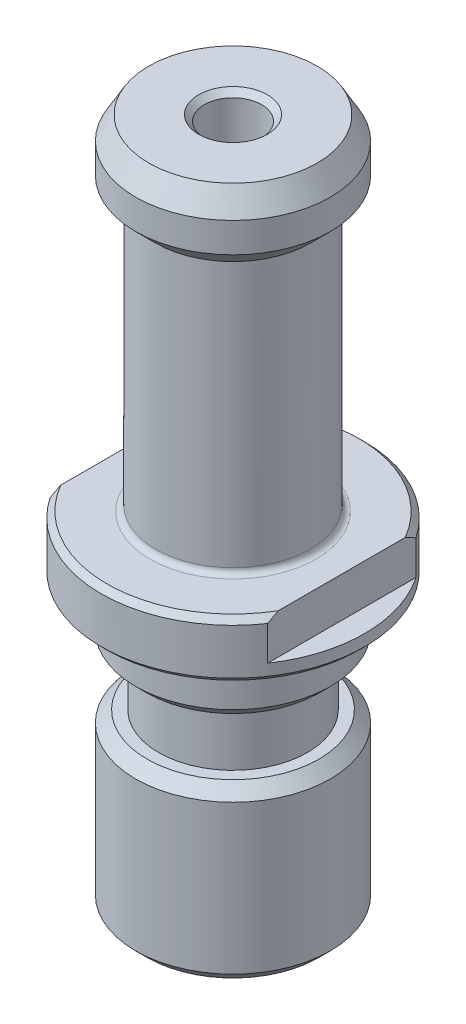
ISO-10303-21;
HEADER;
FILE_DESCRIPTION(('STEP AP214'),'2;1');
FILE_NAME('part.step','',(''),(''),'','','');
FILE_SCHEMA(('AUTOMOTIVE_DESIGN { 1 0 10303 214 1 1 1 1 }'));
ENDSEC;
DATA;
#1=APPLICATION_CONTEXT('core data for automotive mechanical design processes');
#2=APPLICATION_PROTOCOL_DEFINITION('international standard','automotive_design',2000,#1);
#3=PRODUCT_CONTEXT('',#1,'mechanical');
#4=PRODUCT('Part','Part','',(#3));
#5=PRODUCT_RELATED_PRODUCT_CATEGORY('part','',(#4));
#6=PRODUCT_DEFINITION_FORMATION('','',#4);
#7=PRODUCT_DEFINITION_CONTEXT('part definition',#1,'design');
#8=PRODUCT_DEFINITION('design','',#6,#7);
#9=PRODUCT_DEFINITION_SHAPE('','',#8);
#10=(LENGTH_UNIT() NAMED_UNIT(*) SI_UNIT(.MILLI.,.METRE.));
#11=(NAMED_UNIT(*) PLANE_ANGLE_UNIT() SI_UNIT($,.RADIAN.));
#12=(NAMED_UNIT(*) SI_UNIT($,.STERADIAN.) SOLID_ANGLE_UNIT());
#13=UNCERTAINTY_MEASURE_WITH_UNIT(LENGTH_MEASURE(1.E-05),#10,'distance_accuracy_value','');
#14=(GEOMETRIC_REPRESENTATION_CONTEXT(3) GLOBAL_UNCERTAINTY_ASSIGNED_CONTEXT((#13)) GLOBAL_UNIT_ASSIGNED_CONTEXT((#10,
#11,#12)) REPRESENTATION_CONTEXT('',''));
#15=CARTESIAN_POINT('',(0.,0.,0.));
#16=DIRECTION('',(0.,0.,1.));
#17=DIRECTION('',(1.,0.,0.));
#18=AXIS2_PLACEMENT_3D('',#15,#16,#17);
#19=CARTESIAN_POINT('',(0.,14.,0.));
#20=DIRECTION('',(0.,-1.,0.));
#21=DIRECTION('',(1.,0.,0.));
#22=AXIS2_PLACEMENT_3D('',#19,#20,#21);
#23=CONICAL_SURFACE('',#22,8.5,0.785398163397444);
#24=CARTESIAN_POINT('',(0.,15.,0.));
#25=DIRECTION('',(0.,-1.,0.));
#26=DIRECTION('',(1.,0.,0.));
#27=AXIS2_PLACEMENT_3D('',#24,#25,#26);
#28=CIRCLE('',#27,7.5);
#29=CARTESIAN_POINT('',(7.5,15.,0.));
#30=VERTEX_POINT('',#29);
#31=EDGE_CURVE('E139',#30,#30,#28,.T.);
#32=ORIENTED_EDGE('',*,*,#31,.T.);
#33=EDGE_LOOP('',(#32));
#34=FACE_BOUND('',#33,.T.);
#35=CARTESIAN_POINT('',(0.,14.,0.));
#36=DIRECTION('',(0.,-1.,0.));
#37=DIRECTION('',(0.,0.,-1.));
#38=AXIS2_PLACEMENT_3D('',#35,#36,#37);
#39=CIRCLE('',#38,8.5);
#40=CARTESIAN_POINT('',(0.,14.,-8.5));
#41=VERTEX_POINT('',#40);
#42=EDGE_CURVE('E136',#41,#41,#39,.T.);
#43=ORIENTED_EDGE('',*,*,#42,.F.);
#44=EDGE_LOOP('',(#43));
#45=FACE_BOUND('',#44,.T.);
#46=ADVANCED_FACE('F16',(#34,#45),#23,.T.);
#47=CARTESIAN_POINT('',(0.,15.,0.));
#48=DIRECTION('',(0.,-1.,0.));
#49=DIRECTION('',(0.,0.,-1.));
#50=AXIS2_PLACEMENT_3D('',#47,#48,#49);
#51=PLANE('',#50);
#52=CARTESIAN_POINT('',(0.,15.,0.));
#53=DIRECTION('',(0.,1.,0.));
#54=DIRECTION('',(0.,0.,1.));
#55=AXIS2_PLACEMENT_3D('',#52,#53,#54);
#56=CIRCLE('',#55,6.5);
#57=CARTESIAN_POINT('',(0.,15.,6.5));
#58=VERTEX_POINT('',#57);
#59=EDGE_CURVE('E135',#58,#58,#56,.T.);
#60=ORIENTED_EDGE('',*,*,#59,.F.);
#61=EDGE_LOOP('',(#60));
#62=FACE_BOUND('',#61,.T.);
#63=ORIENTED_EDGE('',*,*,#31,.F.);
#64=EDGE_LOOP('',(#63));
#65=FACE_BOUND('',#64,.T.);
#66=ADVANCED_FACE('F255',(#62,#65),#51,.F.);
#67=CARTESIAN_POINT('',(0.,25.,0.));
#68=DIRECTION('',(0.,-1.,0.));
#69=DIRECTION('',(0.,0.,-1.));
#70=AXIS2_PLACEMENT_3D('',#67,#68,#69);
#71=CYLINDRICAL_SURFACE('',#70,8.5);
#72=ORIENTED_EDGE('',*,*,#42,.T.);
#73=EDGE_LOOP('',(#72));
#74=FACE_BOUND('',#73,.T.);
#75=CARTESIAN_POINT('',(0.,1.,0.));
#76=DIRECTION('',(0.,1.,0.));
#77=DIRECTION('',(0.,0.,1.));
#78=AXIS2_PLACEMENT_3D('',#75,#76,#77);
#79=CIRCLE('',#78,8.5);
#80=CARTESIAN_POINT('',(0.,1.,8.5));
#81=VERTEX_POINT('',#80);
#82=EDGE_CURVE('E131',#81,#81,#79,.F.);
#83=ORIENTED_EDGE('',*,*,#82,.F.);
#84=EDGE_LOOP('',(#83));
#85=FACE_BOUND('',#84,.T.);
#86=ADVANCED_FACE('F252',(#74,#85),#71,.T.);
#87=CARTESIAN_POINT('',(0.,15.,0.));
#88=DIRECTION('',(0.,1.,0.));
#89=DIRECTION('',(0.,0.,1.));
#90=AXIS2_PLACEMENT_3D('',#87,#88,#89);
#91=CYLINDRICAL_SURFACE('',#90,6.5);
#92=CARTESIAN_POINT('',(0.,20.,0.));
#93=DIRECTION('',(0.,1.,0.));
#94=DIRECTION('',(0.,0.,1.));
#95=AXIS2_PLACEMENT_3D('',#92,#93,#94);
#96=CIRCLE('',#95,6.5);
#97=CARTESIAN_POINT('',(0.,20.,6.5));
#98=VERTEX_POINT('',#97);
#99=EDGE_CURVE('E134',#98,#98,#96,.T.);
#100=ORIENTED_EDGE('',*,*,#99,.F.);
#101=EDGE_LOOP('',(#100));
#102=FACE_BOUND('',#101,.T.);
#103=ORIENTED_EDGE('',*,*,#59,.T.);
#104=EDGE_LOOP('',(#103));
#105=FACE_BOUND('',#104,.T.);
#106=ADVANCED_FACE('F248',(#102,#105),#91,.T.);
#107=CARTESIAN_POINT('',(0.,1.,0.));
#108=DIRECTION('',(0.,1.,0.));
#109=DIRECTION('',(0.,0.,1.));
#110=AXIS2_PLACEMENT_3D('',#107,#108,#109);
#111=CONICAL_SURFACE('',#110,8.5,0.785398163397445);
#112=CARTESIAN_POINT('',(0.,0.,0.));
#113=DIRECTION('',(0.,1.,0.));
#114=DIRECTION('',(0.,0.,1.));
#115=AXIS2_PLACEMENT_3D('',#112,#113,#114);
#116=CIRCLE('',#115,7.5);
#117=CARTESIAN_POINT('',(0.,0.,7.5));
#118=VERTEX_POINT('',#117);
#119=EDGE_CURVE('E351',#118,#118,#116,.T.);
#120=ORIENTED_EDGE('',*,*,#119,.T.);
#121=EDGE_LOOP('',(#120));
#122=FACE_BOUND('',#121,.T.);
#123=ORIENTED_EDGE('',*,*,#82,.T.);
#124=EDGE_LOOP('',(#123));
#125=FACE_BOUND('',#124,.T.);
#126=ADVANCED_FACE('F244',(#122,#125),#111,.T.);
#127=CARTESIAN_POINT('',(0.,20.,0.));
#128=DIRECTION('',(0.,-1.,0.));
#129=DIRECTION('',(0.,0.,-1.));
#130=AXIS2_PLACEMENT_3D('',#127,#128,#129);
#131=PLANE('',#130);
#132=ORIENTED_EDGE('',*,*,#99,.T.);
#133=EDGE_LOOP('',(#132));
#134=FACE_BOUND('',#133,.T.);
#135=CARTESIAN_POINT('',(0.,20.,0.));
#136=DIRECTION('',(0.,1.,0.));
#137=DIRECTION('',(0.,0.,1.));
#138=AXIS2_PLACEMENT_3D('',#135,#136,#137);
#139=CIRCLE('',#138,7.5);
#140=CARTESIAN_POINT('',(0.,20.,7.5));
#141=VERTEX_POINT('',#140);
#142=EDGE_CURVE('E348',#141,#141,#139,.T.);
#143=ORIENTED_EDGE('',*,*,#142,.F.);
#144=EDGE_LOOP('',(#143));
#145=FACE_BOUND('',#144,.T.);
#146=ADVANCED_FACE('F240',(#134,#145),#131,.T.);
#147=CARTESIAN_POINT('',(0.,0.,0.));
#148=DIRECTION('',(0.,1.,0.));
#149=DIRECTION('',(0.,0.,1.));
#150=AXIS2_PLACEMENT_3D('',#147,#148,#149);
#151=PLANE('',#150);
#152=ORIENTED_EDGE('',*,*,#119,.F.);
#153=EDGE_LOOP('',(#152));
#154=FACE_BOUND('',#153,.T.);
#155=CARTESIAN_POINT('',(0.,0.,0.));
#156=DIRECTION('',(0.,-1.,0.));
#157=DIRECTION('',(0.,0.,-1.));
#158=AXIS2_PLACEMENT_3D('',#155,#156,#157);
#159=CIRCLE('',#158,3.00000000004274);
#160=CARTESIAN_POINT('',(0.,0.,-3.00000000004274));
#161=VERTEX_POINT('',#160);
#162=EDGE_CURVE('E130',#161,#161,#159,.F.);
#163=ORIENTED_EDGE('',*,*,#162,.T.);
#164=EDGE_LOOP('',(#163));
#165=FACE_BOUND('',#164,.T.);
#166=ADVANCED_FACE('F236',(#154,#165),#151,.F.);
#167=CARTESIAN_POINT('',(0.,21.,0.));
#168=DIRECTION('',(0.,1.,0.));
#169=DIRECTION('',(0.,0.,1.));
#170=AXIS2_PLACEMENT_3D('',#167,#168,#169);
#171=CONICAL_SURFACE('',#170,8.5,0.785398163397452);
#172=ORIENTED_EDGE('',*,*,#142,.T.);
#173=EDGE_LOOP('',(#172));
#174=FACE_BOUND('',#173,.T.);
#175=CARTESIAN_POINT('',(0.,21.,0.));
#176=DIRECTION('',(0.,-1.,0.));
#177=DIRECTION('',(0.,0.,-1.));
#178=AXIS2_PLACEMENT_3D('',#175,#176,#177);
#179=CIRCLE('',#178,8.5);
#180=CARTESIAN_POINT('',(0.,21.,-8.5));
#181=VERTEX_POINT('',#180);
#182=EDGE_CURVE('E127',#181,#181,#179,.F.);
#183=ORIENTED_EDGE('',*,*,#182,.F.);
#184=EDGE_LOOP('',(#183));
#185=FACE_BOUND('',#184,.T.);
#186=ADVANCED_FACE('F232',(#174,#185),#171,.T.);
#187=CARTESIAN_POINT('',(0.,0.,0.));
#188=DIRECTION('',(0.,-1.,0.));
#189=DIRECTION('',(0.,0.,-1.));
#190=AXIS2_PLACEMENT_3D('',#187,#188,#189);
#191=CONICAL_SURFACE('',#190,3.00000000004274,0.785398163397448);
#192=CARTESIAN_POINT('',(0.,0.5,0.));
#193=DIRECTION('',(0.,-1.,0.));
#194=DIRECTION('',(0.,0.,-1.));
#195=AXIS2_PLACEMENT_3D('',#192,#193,#194);
#196=CIRCLE('',#195,2.5);
#197=CARTESIAN_POINT('',(0.,0.5,-2.5));
#198=VERTEX_POINT('',#197);
#199=EDGE_CURVE('E124',#198,#198,#196,.F.);
#200=ORIENTED_EDGE('',*,*,#199,.T.);
#201=EDGE_LOOP('',(#200));
#202=FACE_BOUND('',#201,.T.);
#203=ORIENTED_EDGE('',*,*,#162,.F.);
#204=EDGE_LOOP('',(#203));
#205=FACE_BOUND('',#204,.T.);
#206=ADVANCED_FACE('F228',(#202,#205),#191,.F.);
#207=CARTESIAN_POINT('',(0.,25.,0.));
#208=DIRECTION('',(0.,-1.,0.));
#209=DIRECTION('',(0.,0.,-1.));
#210=AXIS2_PLACEMENT_3D('',#207,#208,#209);
#211=CYLINDRICAL_SURFACE('',#210,8.5);
#212=CARTESIAN_POINT('',(0.,25.,0.));
#213=DIRECTION('',(0.,-1.,0.));
#214=DIRECTION('',(0.,0.,-1.));
#215=AXIS2_PLACEMENT_3D('',#212,#213,#214);
#216=CIRCLE('',#215,8.5);
#217=CARTESIAN_POINT('',(0.,25.,-8.5));
#218=VERTEX_POINT('',#217);
#219=EDGE_CURVE('E123',#218,#218,#216,.F.);
#220=ORIENTED_EDGE('',*,*,#219,.F.);
#221=EDGE_LOOP('',(#220));
#222=FACE_BOUND('',#221,.T.);
#223=ORIENTED_EDGE('',*,*,#182,.T.);
#224=EDGE_LOOP('',(#223));
#225=FACE_BOUND('',#224,.T.);
#226=ADVANCED_FACE('F224',(#222,#225),#211,.T.);
#227=CARTESIAN_POINT('',(0.,0.,0.));
#228=DIRECTION('',(0.,-1.,0.));
#229=DIRECTION('',(0.,0.,-1.));
#230=AXIS2_PLACEMENT_3D('',#227,#228,#229);
#231=CYLINDRICAL_SURFACE('',#230,2.5);
#232=CARTESIAN_POINT('',(0.,59.5000000000709,0.));
#233=DIRECTION('',(0.,1.,0.));
#234=DIRECTION('',(0.,0.,1.));
#235=AXIS2_PLACEMENT_3D('',#232,#233,#234);
#236=CIRCLE('',#235,2.49999999999772);
#237=CARTESIAN_POINT('',(0.,59.5000000000709,2.49999999999772));
#238=VERTEX_POINT('',#237);
#239=EDGE_CURVE('E119',#238,#238,#236,.T.);
#240=ORIENTED_EDGE('',*,*,#239,.T.);
#241=EDGE_LOOP('',(#240));
#242=FACE_BOUND('',#241,.T.);
#243=ORIENTED_EDGE('',*,*,#199,.F.);
#244=EDGE_LOOP('',(#243));
#245=FACE_BOUND('',#244,.T.);
#246=ADVANCED_FACE('F220',(#242,#245),#231,.F.);
#247=CARTESIAN_POINT('',(0.,25.,0.));
#248=DIRECTION('',(0.,-1.,0.));
#249=DIRECTION('',(0.,0.,-1.));
#250=AXIS2_PLACEMENT_3D('',#247,#248,#249);
#251=PLANE('',#250);
#252=ORIENTED_EDGE('',*,*,#219,.T.);
#253=EDGE_LOOP('',(#252));
#254=FACE_BOUND('',#253,.T.);
#255=CARTESIAN_POINT('',(0.,25.,0.));
#256=DIRECTION('',(0.,1.,0.));
#257=DIRECTION('',(-1.,0.,0.));
#258=AXIS2_PLACEMENT_3D('',#255,#256,#257);
#259=CIRCLE('',#258,11.);
#260=CARTESIAN_POINT('',(-11.,25.,0.));
#261=VERTEX_POINT('',#260);
#262=EDGE_CURVE('E122',#261,#261,#259,.T.);
#263=ORIENTED_EDGE('',*,*,#262,.F.);
#264=EDGE_LOOP('',(#263));
#265=FACE_BOUND('',#264,.T.);
#266=ADVANCED_FACE('F216',(#254,#265),#251,.T.);
#267=CARTESIAN_POINT('',(0.,60.0000000000023,0.));
#268=DIRECTION('',(0.,1.,0.));
#269=DIRECTION('',(0.,0.,1.));
#270=AXIS2_PLACEMENT_3D('',#267,#268,#269);
#271=CONICAL_SURFACE('',#270,2.99999999992906,0.785398163397448);
#272=ORIENTED_EDGE('',*,*,#239,.F.);
#273=EDGE_LOOP('',(#272));
#274=FACE_BOUND('',#273,.T.);
#275=CARTESIAN_POINT('',(0.,60.0000000000023,0.));
#276=DIRECTION('',(0.,1.,0.));
#277=DIRECTION('',(0.,0.,1.));
#278=AXIS2_PLACEMENT_3D('',#275,#276,#277);
#279=CIRCLE('',#278,2.99999999992906);
#280=CARTESIAN_POINT('',(0.,60.0000000000023,2.99999999992906));
#281=VERTEX_POINT('',#280);
#282=EDGE_CURVE('E87',#281,#281,#279,.F.);
#283=ORIENTED_EDGE('',*,*,#282,.F.);
#284=EDGE_LOOP('',(#283));
#285=FACE_BOUND('',#284,.T.);
#286=ADVANCED_FACE('F212',(#274,#285),#271,.F.);
#287=CARTESIAN_POINT('',(0.,25.5,0.));
#288=DIRECTION('',(0.,1.,0.));
#289=DIRECTION('',(-1.,0.,0.));
#290=AXIS2_PLACEMENT_3D('',#287,#288,#289);
#291=CONICAL_SURFACE('',#290,11.5,0.785398163397452);
#292=ORIENTED_EDGE('',*,*,#262,.T.);
#293=EDGE_LOOP('',(#292));
#294=FACE_BOUND('',#293,.T.);
#295=CARTESIAN_POINT('',(0.,25.5,0.));
#296=DIRECTION('',(0.,-1.,0.));
#297=DIRECTION('',(0.,0.,-1.));
#298=AXIS2_PLACEMENT_3D('',#295,#296,#297);
#299=CIRCLE('',#298,11.5);
#300=CARTESIAN_POINT('',(0.,25.5,-11.5));
#301=VERTEX_POINT('',#300);
#302=EDGE_CURVE('E116',#301,#301,#299,.F.);
#303=ORIENTED_EDGE('',*,*,#302,.F.);
#304=EDGE_LOOP('',(#303));
#305=FACE_BOUND('',#304,.T.);
#306=ADVANCED_FACE('F208',(#294,#305),#291,.T.);
#307=CARTESIAN_POINT('',(0.,60.,0.));
#308=DIRECTION('',(0.,1.,0.));
#309=DIRECTION('',(0.,0.,1.));
#310=AXIS2_PLACEMENT_3D('',#307,#308,#309);
#311=PLANE('',#310);
#312=CARTESIAN_POINT('',(0.,60.,0.));
#313=DIRECTION('',(0.,-1.,0.));
#314=DIRECTION('',(0.,0.,-1.));
#315=AXIS2_PLACEMENT_3D('',#312,#313,#314);
#316=CIRCLE('',#315,7.34529946162073);
#317=CARTESIAN_POINT('',(0.,60.,-7.34529946162073));
#318=VERTEX_POINT('',#317);
#319=EDGE_CURVE('E98',#318,#318,#316,.T.);
#320=ORIENTED_EDGE('',*,*,#319,.F.);
#321=EDGE_LOOP('',(#320));
#322=FACE_BOUND('',#321,.T.);
#323=ORIENTED_EDGE('',*,*,#282,.T.);
#324=EDGE_LOOP('',(#323));
#325=FACE_BOUND('',#324,.T.);
#326=ADVANCED_FACE('F205',(#322,#325),#311,.T.);
#327=CARTESIAN_POINT('',(0.,26.5,0.));
#328=DIRECTION('',(0.,1.,0.));
#329=DIRECTION('',(0.,0.,1.));
#330=AXIS2_PLACEMENT_3D('',#327,#328,#329);
#331=PLANE('',#330);
#332=CARTESIAN_POINT('',(0.,26.5,0.));
#333=DIRECTION('',(0.,-1.,0.));
#334=DIRECTION('',(0.,0.,-1.));
#335=AXIS2_PLACEMENT_3D('',#332,#333,#334);
#336=CIRCLE('',#335,11.5);
#337=CARTESIAN_POINT('',(9.5,26.5,-6.48074069840785));
#338=VERTEX_POINT('',#337);
#339=CARTESIAN_POINT('',(9.5,26.5,6.48074069840786));
#340=VERTEX_POINT('',#339);
#341=EDGE_CURVE('E74',#338,#340,#336,.T.);
#342=ORIENTED_EDGE('',*,*,#341,.F.);
#343=DIRECTION('',(0.,0.,-1.));
#344=VECTOR('',#343,1.);
#345=CARTESIAN_POINT('',(9.5,26.5,25.));
#346=LINE('',#345,#344);
#347=EDGE_CURVE('E89',#340,#338,#346,.T.);
#348=ORIENTED_EDGE('',*,*,#347,.F.);
#349=EDGE_LOOP('',(#342,#348));
#350=FACE_BOUND('',#349,.T.);
#351=ADVANCED_FACE('F90',(#350),#331,.T.);
#352=CARTESIAN_POINT('',(0.,26.5,0.));
#353=DIRECTION('',(0.,1.,0.));
#354=DIRECTION('',(0.,0.,1.));
#355=AXIS2_PLACEMENT_3D('',#352,#353,#354);
#356=PLANE('',#355);
#357=CARTESIAN_POINT('',(0.,26.5,0.));
#358=DIRECTION('',(0.,-1.,0.));
#359=DIRECTION('',(0.,0.,-1.));
#360=AXIS2_PLACEMENT_3D('',#357,#358,#359);
#361=CIRCLE('',#360,11.5);
#362=CARTESIAN_POINT('',(-9.5,26.5,6.48074069840787));
#363=VERTEX_POINT('',#362);
#364=CARTESIAN_POINT('',(-9.5,26.5,-6.48074069840787));
#365=VERTEX_POINT('',#364);
#366=EDGE_CURVE('E86',#363,#365,#361,.T.);
#367=ORIENTED_EDGE('',*,*,#366,.F.);
#368=DIRECTION('',(0.,0.,1.));
#369=VECTOR('',#368,1.);
#370=CARTESIAN_POINT('',(-9.5,26.5,25.));
#371=LINE('',#370,#369);
#372=EDGE_CURVE('E112',#365,#363,#371,.T.);
#373=ORIENTED_EDGE('',*,*,#372,.F.);
#374=EDGE_LOOP('',(#367,#373));
#375=FACE_BOUND('',#374,.T.);
#376=ADVANCED_FACE('F199',(#375),#356,.T.);
#377=CARTESIAN_POINT('',(0.,60.,0.));
#378=DIRECTION('',(0.,-1.,0.));
#379=DIRECTION('',(0.,0.,-1.));
#380=AXIS2_PLACEMENT_3D('',#377,#378,#379);
#381=CYLINDRICAL_SURFACE('',#380,11.5);
#382=DIRECTION('',(0.,1.,0.));
#383=VECTOR('',#382,1.);
#384=CARTESIAN_POINT('',(9.5,26.5,6.48074069840786));
#385=LINE('',#384,#383);
#386=CARTESIAN_POINT('',(9.5,29.5,6.48074069840785));
#387=VERTEX_POINT('',#386);
#388=EDGE_CURVE('E81',#387,#340,#385,.F.);
#389=ORIENTED_EDGE('',*,*,#388,.F.);
#390=CARTESIAN_POINT('',(0.,29.5,0.));
#391=DIRECTION('',(0.,-1.,0.));
#392=DIRECTION('',(0.,0.,-1.));
#393=AXIS2_PLACEMENT_3D('',#390,#391,#392);
#394=CIRCLE('',#393,11.5);
#395=CARTESIAN_POINT('',(-9.5,29.5,6.48074069840786));
#396=VERTEX_POINT('',#395);
#397=EDGE_CURVE('E96',#396,#387,#394,.F.);
#398=ORIENTED_EDGE('',*,*,#397,.F.);
#399=DIRECTION('',(0.,1.,0.));
#400=VECTOR('',#399,1.);
#401=CARTESIAN_POINT('',(-9.5,26.5,6.48074069840787));
#402=LINE('',#401,#400);
#403=EDGE_CURVE('E114',#363,#396,#402,.T.);
#404=ORIENTED_EDGE('',*,*,#403,.F.);
#405=ORIENTED_EDGE('',*,*,#366,.T.);
#406=DIRECTION('',(0.,1.,0.));
#407=VECTOR('',#406,1.);
#408=CARTESIAN_POINT('',(-9.5,26.5,-6.48074069840787));
#409=LINE('',#408,#407);
#410=CARTESIAN_POINT('',(-9.5,29.5,-6.48074069840786));
#411=VERTEX_POINT('',#410);
#412=EDGE_CURVE('E106',#411,#365,#409,.F.);
#413=ORIENTED_EDGE('',*,*,#412,.F.);
#414=CARTESIAN_POINT('',(0.,29.5,0.));
#415=DIRECTION('',(0.,-1.,0.));
#416=DIRECTION('',(0.,0.,-1.));
#417=AXIS2_PLACEMENT_3D('',#414,#415,#416);
#418=CIRCLE('',#417,11.5);
#419=CARTESIAN_POINT('',(9.5,29.5,-6.48074069840785));
#420=VERTEX_POINT('',#419);
#421=EDGE_CURVE('E103',#420,#411,#418,.F.);
#422=ORIENTED_EDGE('',*,*,#421,.F.);
#423=DIRECTION('',(0.,1.,0.));
#424=VECTOR('',#423,1.);
#425=CARTESIAN_POINT('',(9.5,26.5,-6.48074069840785));
#426=LINE('',#425,#424);
#427=EDGE_CURVE('E84',#338,#420,#426,.T.);
#428=ORIENTED_EDGE('',*,*,#427,.F.);
#429=ORIENTED_EDGE('',*,*,#341,.T.);
#430=EDGE_LOOP('',(#389,#398,#404,#405,#413,#422,#428,#429));
#431=FACE_BOUND('',#430,.T.);
#432=ORIENTED_EDGE('',*,*,#302,.T.);
#433=EDGE_LOOP('',(#432));
#434=FACE_BOUND('',#433,.T.);
#435=ADVANCED_FACE('F78',(#431,#434),#381,.T.);
#436=CARTESIAN_POINT('',(0.,58.,0.));
#437=DIRECTION('',(0.,-1.,0.));
#438=DIRECTION('',(0.,0.,-1.));
#439=AXIS2_PLACEMENT_3D('',#436,#437,#438);
#440=CONICAL_SURFACE('',#439,8.5,0.523598775598299);
#441=CARTESIAN_POINT('',(0.,58.,0.));
#442=DIRECTION('',(0.,1.,0.));
#443=DIRECTION('',(0.,0.,1.));
#444=AXIS2_PLACEMENT_3D('',#441,#442,#443);
#445=CIRCLE('',#444,8.5);
#446=CARTESIAN_POINT('',(0.,58.,8.5));
#447=VERTEX_POINT('',#446);
#448=EDGE_CURVE('E148',#447,#447,#445,.F.);
#449=ORIENTED_EDGE('',*,*,#448,.F.);
#450=EDGE_LOOP('',(#449));
#451=FACE_BOUND('',#450,.T.);
#452=ORIENTED_EDGE('',*,*,#319,.T.);
#453=EDGE_LOOP('',(#452));
#454=FACE_BOUND('',#453,.T.);
#455=ADVANCED_FACE('F191',(#451,#454),#440,.T.);
#456=CARTESIAN_POINT('',(0.,29.5,0.));
#457=DIRECTION('',(0.,-1.,0.));
#458=DIRECTION('',(1.,0.,0.));
#459=AXIS2_PLACEMENT_3D('',#456,#457,#458);
#460=CONICAL_SURFACE('',#459,11.5,0.785398163397445);
#461=CARTESIAN_POINT('',(-9.5,29.5,6.48074069840786));
#462=CARTESIAN_POINT('',(-9.5,29.5434024502784,6.40372265845442));
#463=CARTESIAN_POINT('',(-9.5,29.5864052052821,6.32647872857657));
#464=CARTESIAN_POINT('',(-9.5,29.671555802403,6.17153461480119));
#465=CARTESIAN_POINT('',(-9.5,29.7137037578524,6.09383449317204));
#466=CARTESIAN_POINT('',(-9.5,29.7971012369425,5.93795223956829));
#467=CARTESIAN_POINT('',(-9.5,29.8383507521402,5.85977010307291));
#468=CARTESIAN_POINT('',(-9.5,29.9199016831173,5.70289977620134));
#469=CARTESIAN_POINT('',(-9.5,29.9602029716032,5.62421151966688));
#470=CARTESIAN_POINT('',(-9.5,30.,5.54526825320477));
#471=B_SPLINE_CURVE_WITH_KNOTS('',3,(#461,#462,#463,#464,#465,#466,#467,#468,#469,#470),
.UNSPECIFIED.,.F.,.F.,(4,2,2,2,4),(0.,0.265216437412214,0.530397478546416,0.795581010579887,
1.06079994103845),.UNSPECIFIED.);
#472=CARTESIAN_POINT('',(-9.5,30.,5.54526825320471));
#473=VERTEX_POINT('',#472);
#474=EDGE_CURVE('E158',#396,#473,#471,.T.);
#475=ORIENTED_EDGE('',*,*,#474,.F.);
#476=ORIENTED_EDGE('',*,*,#397,.T.);
#477=CARTESIAN_POINT('',(9.5,30.,5.54526825320469));
#478=CARTESIAN_POINT('',(9.5,29.9602029716032,5.62421151966682));
#479=CARTESIAN_POINT('',(9.5,29.9199016831174,5.70289977620129));
#480=CARTESIAN_POINT('',(9.5,29.8383507521402,5.85977010307287));
#481=CARTESIAN_POINT('',(9.5,29.7971012369425,5.93795223956826));
#482=CARTESIAN_POINT('',(9.5,29.7137037578524,6.09383449317202));
#483=CARTESIAN_POINT('',(9.5,29.671555802403,6.17153461480117));
#484=CARTESIAN_POINT('',(9.5,29.5864052052821,6.32647872857657));
#485=CARTESIAN_POINT('',(9.5,29.5434024502784,6.40372265845443));
#486=CARTESIAN_POINT('',(9.5,29.5,6.48074069840788));
#487=B_SPLINE_CURVE_WITH_KNOTS('',3,(#477,#478,#479,#480,#481,#482,#483,#484,#485,#486),
.UNSPECIFIED.,.F.,.F.,(4,2,2,2,4),(0.,0.265218930458585,0.530402462492076,0.795583503626296,
1.06079994103854),.UNSPECIFIED.);
#488=CARTESIAN_POINT('',(9.5,30.,5.54526825320469));
#489=VERTEX_POINT('',#488);
#490=EDGE_CURVE('E95',#489,#387,#487,.T.);
#491=ORIENTED_EDGE('',*,*,#490,.F.);
#492=CARTESIAN_POINT('',(0.,30.,0.));
#493=DIRECTION('',(0.,-1.,0.));
#494=DIRECTION('',(1.,0.,0.));
#495=AXIS2_PLACEMENT_3D('',#492,#493,#494);
#496=CIRCLE('',#495,11.);
#497=EDGE_CURVE('E145',#473,#489,#496,.F.);
#498=ORIENTED_EDGE('',*,*,#497,.F.);
#499=EDGE_LOOP('',(#475,#476,#491,#498));
#500=FACE_BOUND('',#499,.T.);
#501=ADVANCED_FACE('F187',(#500),#460,.T.);
#502=CARTESIAN_POINT('',(9.5,26.5,25.));
#503=DIRECTION('',(1.,0.,0.));
#504=DIRECTION('',(0.,0.,-1.));
#505=AXIS2_PLACEMENT_3D('',#502,#503,#504);
#506=PLANE('',#505);
#507=DIRECTION('',(0.,0.,1.));
#508=VECTOR('',#507,1.);
#509=CARTESIAN_POINT('',(9.5,30.,0.));
#510=LINE('',#509,#508);
#511=CARTESIAN_POINT('',(9.5,30.,-5.5452682532047));
#512=VERTEX_POINT('',#511);
#513=EDGE_CURVE('E144',#489,#512,#510,.F.);
#514=ORIENTED_EDGE('',*,*,#513,.F.);
#515=ORIENTED_EDGE('',*,*,#490,.T.);
#516=ORIENTED_EDGE('',*,*,#388,.T.);
#517=ORIENTED_EDGE('',*,*,#347,.T.);
#518=ORIENTED_EDGE('',*,*,#427,.T.);
#519=CARTESIAN_POINT('',(9.5,30.,-5.5452682532047));
#520=CARTESIAN_POINT('',(9.5,29.9602029716032,-5.62421151966682));
#521=CARTESIAN_POINT('',(9.5,29.9199016831174,-5.70289977620129));
#522=CARTESIAN_POINT('',(9.5,29.8383507521402,-5.85977010307288));
#523=CARTESIAN_POINT('',(9.5,29.7971012369425,-5.93795223956826));
#524=CARTESIAN_POINT('',(9.5,29.7137037578524,-6.09383449317203));
#525=CARTESIAN_POINT('',(9.5,29.671555802403,-6.17153461480118));
#526=CARTESIAN_POINT('',(9.5,29.5864052052821,-6.32647872857657));
#527=CARTESIAN_POINT('',(9.5,29.5434024502784,-6.40372265845443));
#528=CARTESIAN_POINT('',(9.5,29.5,-6.48074069840788));
#529=B_SPLINE_CURVE_WITH_KNOTS('',3,(#519,#520,#521,#522,#523,#524,#525,#526,#527,#528),
.UNSPECIFIED.,.F.,.F.,(4,2,2,2,4),(0.,0.265218930458582,0.53040246249207,0.795583503626288,
1.06079994103853),.UNSPECIFIED.);
#530=EDGE_CURVE('E107',#512,#420,#529,.T.);
#531=ORIENTED_EDGE('',*,*,#530,.F.);
#532=EDGE_LOOP('',(#514,#515,#516,#517,#518,#531));
#533=FACE_BOUND('',#532,.T.);
#534=ADVANCED_FACE('F94',(#533),#506,.T.);
#535=CARTESIAN_POINT('',(0.,29.5,0.));
#536=DIRECTION('',(0.,-1.,0.));
#537=DIRECTION('',(1.,0.,0.));
#538=AXIS2_PLACEMENT_3D('',#535,#536,#537);
#539=CONICAL_SURFACE('',#538,11.5,0.785398163397445);
#540=ORIENTED_EDGE('',*,*,#421,.T.);
#541=CARTESIAN_POINT('',(-9.5,30.,-5.54526825320471));
#542=CARTESIAN_POINT('',(-9.5,29.9602029716032,-5.62421151966683));
#543=CARTESIAN_POINT('',(-9.5,29.9199016831174,-5.7028997762013));
#544=CARTESIAN_POINT('',(-9.5,29.8383507521402,-5.85977010307288));
#545=CARTESIAN_POINT('',(-9.5,29.7971012369425,-5.93795223956827));
#546=CARTESIAN_POINT('',(-9.5,29.7137037578524,-6.09383449317204));
#547=CARTESIAN_POINT('',(-9.5,29.671555802403,-6.17153461480119));
#548=CARTESIAN_POINT('',(-9.5,29.5864052052821,-6.32647872857658));
#549=CARTESIAN_POINT('',(-9.5,29.5434024502784,-6.40372265845444));
#550=CARTESIAN_POINT('',(-9.5,29.5,-6.48074069840789));
#551=B_SPLINE_CURVE_WITH_KNOTS('',3,(#541,#542,#543,#544,#545,#546,#547,#548,#549,#550),
.UNSPECIFIED.,.F.,.F.,(4,2,2,2,4),(0.,0.265218930458581,0.53040246249207,0.795583503626291,
1.06079994103853),.UNSPECIFIED.);
#552=CARTESIAN_POINT('',(-9.5,30.,-5.54526825320471));
#553=VERTEX_POINT('',#552);
#554=EDGE_CURVE('E149',#553,#411,#551,.T.);
#555=ORIENTED_EDGE('',*,*,#554,.F.);
#556=CARTESIAN_POINT('',(0.,30.,0.));
#557=DIRECTION('',(0.,-1.,0.));
#558=DIRECTION('',(1.,0.,0.));
#559=AXIS2_PLACEMENT_3D('',#556,#557,#558);
#560=CIRCLE('',#559,11.);
#561=EDGE_CURVE('E140',#512,#553,#560,.F.);
#562=ORIENTED_EDGE('',*,*,#561,.F.);
#563=ORIENTED_EDGE('',*,*,#530,.T.);
#564=EDGE_LOOP('',(#540,#555,#562,#563));
#565=FACE_BOUND('',#564,.T.);
#566=ADVANCED_FACE('F168',(#565),#539,.T.);
#567=CARTESIAN_POINT('',(-9.5,26.5,25.));
#568=DIRECTION('',(-1.,0.,0.));
#569=DIRECTION('',(0.,0.,1.));
#570=AXIS2_PLACEMENT_3D('',#567,#568,#569);
#571=PLANE('',#570);
#572=DIRECTION('',(0.,0.,1.));
#573=VECTOR('',#572,1.);
#574=CARTESIAN_POINT('',(-9.5,30.,0.));
#575=LINE('',#574,#573);
#576=EDGE_CURVE('E143',#553,#473,#575,.T.);
#577=ORIENTED_EDGE('',*,*,#576,.F.);
#578=ORIENTED_EDGE('',*,*,#554,.T.);
#579=ORIENTED_EDGE('',*,*,#412,.T.);
#580=ORIENTED_EDGE('',*,*,#372,.T.);
#581=ORIENTED_EDGE('',*,*,#403,.T.);
#582=ORIENTED_EDGE('',*,*,#474,.T.);
#583=EDGE_LOOP('',(#577,#578,#579,#580,#581,#582));
#584=FACE_BOUND('',#583,.T.);
#585=ADVANCED_FACE('F165',(#584),#571,.T.);
#586=CARTESIAN_POINT('',(0.,30.,0.));
#587=DIRECTION('',(0.,1.,0.));
#588=DIRECTION('',(0.,0.,1.));
#589=AXIS2_PLACEMENT_3D('',#586,#587,#588);
#590=CYLINDRICAL_SURFACE('',#589,8.5);
#591=ORIENTED_EDGE('',*,*,#448,.T.);
#592=EDGE_LOOP('',(#591));
#593=FACE_BOUND('',#592,.T.);
#594=CARTESIAN_POINT('',(0.,55.3999999999633,0.));
#595=DIRECTION('',(0.,1.,0.));
#596=DIRECTION('',(0.,0.,1.));
#597=AXIS2_PLACEMENT_3D('',#594,#595,#596);
#598=CIRCLE('',#597,8.50000000002638);
#599=CARTESIAN_POINT('',(0.,55.3999999999633,8.50000000002638));
#600=VERTEX_POINT('',#599);
#601=EDGE_CURVE('E288',#600,#600,#598,.F.);
#602=ORIENTED_EDGE('',*,*,#601,.F.);
#603=EDGE_LOOP('',(#602));
#604=FACE_BOUND('',#603,.T.);
#605=ADVANCED_FACE('F304',(#593,#604),#590,.T.);
#606=CARTESIAN_POINT('',(0.,30.,0.));
#607=DIRECTION('',(0.,1.,0.));
#608=DIRECTION('',(0.,0.,1.));
#609=AXIS2_PLACEMENT_3D('',#606,#607,#608);
#610=PLANE('',#609);
#611=ORIENTED_EDGE('',*,*,#561,.T.);
#612=ORIENTED_EDGE('',*,*,#576,.T.);
#613=ORIENTED_EDGE('',*,*,#497,.T.);
#614=ORIENTED_EDGE('',*,*,#513,.T.);
#615=EDGE_LOOP('',(#611,#612,#613,#614));
#616=FACE_BOUND('',#615,.T.);
#617=CARTESIAN_POINT('',(0.,30.,0.));
#618=DIRECTION('',(0.,1.,0.));
#619=DIRECTION('',(0.,0.,-1.));
#620=AXIS2_PLACEMENT_3D('',#617,#618,#619);
#621=CIRCLE('',#620,7.25);
#622=CARTESIAN_POINT('',(0.,30.,7.25));
#623=VERTEX_POINT('',#622);
#624=CARTESIAN_POINT('',(0.,30.,-7.25));
#625=VERTEX_POINT('',#624);
#626=EDGE_CURVE('E291',#623,#625,#621,.F.);
#627=ORIENTED_EDGE('',*,*,#626,.T.);
#628=CARTESIAN_POINT('',(0.,30.,0.));
#629=DIRECTION('',(0.,1.,0.));
#630=DIRECTION('',(0.,0.,1.));
#631=AXIS2_PLACEMENT_3D('',#628,#629,#630);
#632=CIRCLE('',#631,7.25);
#633=EDGE_CURVE('E35',#625,#623,#632,.F.);
#634=ORIENTED_EDGE('',*,*,#633,.T.);
#635=EDGE_LOOP('',(#627,#634));
#636=FACE_BOUND('',#635,.T.);
#637=ADVANCED_FACE('F296',(#616,#636),#610,.T.);
#638=CARTESIAN_POINT('',(0.,55.3999999999064,0.));
#639=DIRECTION('',(0.,1.,0.));
#640=DIRECTION('',(-1.,0.,0.));
#641=AXIS2_PLACEMENT_3D('',#638,#639,#640);
#642=CONICAL_SURFACE('',#641,8.49999999996953,0.785398163397448);
#643=ORIENTED_EDGE('',*,*,#601,.T.);
#644=EDGE_LOOP('',(#643));
#645=FACE_BOUND('',#644,.T.);
#646=CARTESIAN_POINT('',(0.,53.65,0.));
#647=DIRECTION('',(0.,-1.,0.));
#648=DIRECTION('',(0.,0.,-1.));
#649=AXIS2_PLACEMENT_3D('',#646,#647,#648);
#650=CIRCLE('',#649,6.75);
#651=CARTESIAN_POINT('',(0.,53.65,-6.75));
#652=VERTEX_POINT('',#651);
#653=EDGE_CURVE('E27',#652,#652,#650,.T.);
#654=ORIENTED_EDGE('',*,*,#653,.F.);
#655=EDGE_LOOP('',(#654));
#656=FACE_BOUND('',#655,.T.);
#657=ADVANCED_FACE('F276',(#645,#656),#642,.T.);
#658=CARTESIAN_POINT('',(0.,30.5,0.));
#659=DIRECTION('',(0.,1.,0.));
#660=DIRECTION('',(0.,0.,1.));
#661=AXIS2_PLACEMENT_3D('',#658,#659,#660);
#662=TOROIDAL_SURFACE('',#661,7.25,0.5);
#663=CARTESIAN_POINT('',(0.,30.5,0.));
#664=DIRECTION('',(0.,-1.,0.));
#665=DIRECTION('',(0.,0.,-1.));
#666=AXIS2_PLACEMENT_3D('',#663,#664,#665);
#667=CIRCLE('',#666,6.75);
#668=CARTESIAN_POINT('',(0.,30.5,-6.75));
#669=VERTEX_POINT('',#668);
#670=EDGE_CURVE('E11',#669,#669,#667,.F.);
#671=ORIENTED_EDGE('',*,*,#670,.F.);
#672=EDGE_LOOP('',(#671));
#673=FACE_BOUND('',#672,.T.);
#674=ORIENTED_EDGE('',*,*,#626,.F.);
#675=ORIENTED_EDGE('',*,*,#633,.F.);
#676=EDGE_LOOP('',(#674,#675));
#677=FACE_BOUND('',#676,.T.);
#678=ADVANCED_FACE('F269',(#673,#677),#662,.F.);
#679=CARTESIAN_POINT('',(0.,53.4,0.));
#680=DIRECTION('',(0.,-1.,0.));
#681=DIRECTION('',(0.,0.,-1.));
#682=AXIS2_PLACEMENT_3D('',#679,#680,#681);
#683=CYLINDRICAL_SURFACE('',#682,6.75);
#684=ORIENTED_EDGE('',*,*,#670,.T.);
#685=EDGE_LOOP('',(#684));
#686=FACE_BOUND('',#685,.T.);
#687=ORIENTED_EDGE('',*,*,#653,.T.);
#688=EDGE_LOOP('',(#687));
#689=FACE_BOUND('',#688,.T.);
#690=ADVANCED_FACE('F267',(#686,#689),#683,.T.);
#691=CLOSED_SHELL('',(#46,#66,#86,#106,#126,#146,#166,#186,#206,#226,#246,#266,#286,#306,#326,
#351,#376,#435,#455,#501,#534,#566,#585,#605,#637,#657,#678,#690));
#692=MANIFOLD_SOLID_BREP('B1',#691);
#693=ADVANCED_BREP_SHAPE_REPRESENTATION('',(#18,#692),#14);
#694=SHAPE_DEFINITION_REPRESENTATION(#9,#693);
ENDSEC;
END-ISO-10303-21;
